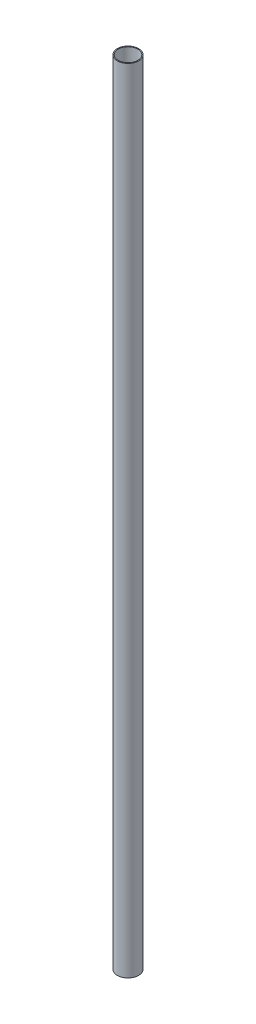
ISO-10303-21;
HEADER;
FILE_DESCRIPTION(('STEP AP214'),'2;1');
FILE_NAME('part.step','',(''),(''),'','','');
FILE_SCHEMA(('AUTOMOTIVE_DESIGN { 1 0 10303 214 1 1 1 1 }'));
ENDSEC;
DATA;
#1=APPLICATION_CONTEXT('core data for automotive mechanical design processes');
#2=APPLICATION_PROTOCOL_DEFINITION('international standard','automotive_design',2000,#1);
#3=PRODUCT_CONTEXT('',#1,'mechanical');
#4=PRODUCT('Part','Part','',(#3));
#5=PRODUCT_RELATED_PRODUCT_CATEGORY('part','',(#4));
#6=PRODUCT_DEFINITION_FORMATION('','',#4);
#7=PRODUCT_DEFINITION_CONTEXT('part definition',#1,'design');
#8=PRODUCT_DEFINITION('design','',#6,#7);
#9=PRODUCT_DEFINITION_SHAPE('','',#8);
#10=(LENGTH_UNIT() NAMED_UNIT(*) SI_UNIT(.MILLI.,.METRE.));
#11=(NAMED_UNIT(*) PLANE_ANGLE_UNIT() SI_UNIT($,.RADIAN.));
#12=(NAMED_UNIT(*) SI_UNIT($,.STERADIAN.) SOLID_ANGLE_UNIT());
#13=UNCERTAINTY_MEASURE_WITH_UNIT(LENGTH_MEASURE(1.E-05),#10,'distance_accuracy_value','');
#14=(GEOMETRIC_REPRESENTATION_CONTEXT(3) GLOBAL_UNCERTAINTY_ASSIGNED_CONTEXT((#13)) GLOBAL_UNIT_ASSIGNED_CONTEXT((#10,
#11,#12)) REPRESENTATION_CONTEXT('',''));
#15=CARTESIAN_POINT('',(0.,0.,0.));
#16=DIRECTION('',(0.,0.,1.));
#17=DIRECTION('',(1.,0.,0.));
#18=AXIS2_PLACEMENT_3D('',#15,#16,#17);
#19=CARTESIAN_POINT('',(0.,445.,0.));
#20=DIRECTION('',(0.,1.,0.));
#21=DIRECTION('',(0.,0.,1.));
#22=AXIS2_PLACEMENT_3D('',#19,#20,#21);
#23=PLANE('',#22);
#24=CARTESIAN_POINT('',(0.,445.,0.));
#25=DIRECTION('',(0.,1.,0.));
#26=DIRECTION('',(0.,0.,1.));
#27=AXIS2_PLACEMENT_3D('',#24,#25,#26);
#28=CIRCLE('',#27,6.);
#29=CARTESIAN_POINT('',(0.,445.,6.));
#30=VERTEX_POINT('',#29);
#31=EDGE_CURVE('E10',#30,#30,#28,.T.);
#32=ORIENTED_EDGE('',*,*,#31,.T.);
#33=EDGE_LOOP('',(#32));
#34=FACE_BOUND('',#33,.T.);
#35=CARTESIAN_POINT('',(0.,445.,0.));
#36=DIRECTION('',(0.,1.,0.));
#37=DIRECTION('',(0.,0.,1.));
#38=AXIS2_PLACEMENT_3D('',#35,#36,#37);
#39=CIRCLE('',#38,5.5);
#40=CARTESIAN_POINT('',(0.,445.,5.5));
#41=VERTEX_POINT('',#40);
#42=EDGE_CURVE('E44',#41,#41,#39,.T.);
#43=ORIENTED_EDGE('',*,*,#42,.F.);
#44=EDGE_LOOP('',(#43));
#45=FACE_BOUND('',#44,.T.);
#46=ADVANCED_FACE('F33',(#34,#45),#23,.T.);
#47=CARTESIAN_POINT('',(0.,0.,0.));
#48=DIRECTION('',(0.,1.,0.));
#49=DIRECTION('',(0.,0.,1.));
#50=AXIS2_PLACEMENT_3D('',#47,#48,#49);
#51=PLANE('',#50);
#52=CARTESIAN_POINT('',(0.,0.,0.));
#53=DIRECTION('',(0.,1.,0.));
#54=DIRECTION('',(0.,0.,1.));
#55=AXIS2_PLACEMENT_3D('',#52,#53,#54);
#56=CIRCLE('',#55,6.);
#57=CARTESIAN_POINT('',(0.,0.,6.));
#58=VERTEX_POINT('',#57);
#59=EDGE_CURVE('E37',#58,#58,#56,.T.);
#60=ORIENTED_EDGE('',*,*,#59,.F.);
#61=EDGE_LOOP('',(#60));
#62=FACE_BOUND('',#61,.T.);
#63=CARTESIAN_POINT('',(0.,0.,0.));
#64=DIRECTION('',(0.,1.,0.));
#65=DIRECTION('',(0.,0.,1.));
#66=AXIS2_PLACEMENT_3D('',#63,#64,#65);
#67=CIRCLE('',#66,5.5);
#68=CARTESIAN_POINT('',(0.,0.,5.5));
#69=VERTEX_POINT('',#68);
#70=EDGE_CURVE('E46',#69,#69,#67,.T.);
#71=ORIENTED_EDGE('',*,*,#70,.T.);
#72=EDGE_LOOP('',(#71));
#73=FACE_BOUND('',#72,.T.);
#74=ADVANCED_FACE('F56',(#62,#73),#51,.F.);
#75=CARTESIAN_POINT('',(0.,445.,0.));
#76=DIRECTION('',(0.,-1.,0.));
#77=DIRECTION('',(0.,0.,-1.));
#78=AXIS2_PLACEMENT_3D('',#75,#76,#77);
#79=CYLINDRICAL_SURFACE('',#78,6.);
#80=ORIENTED_EDGE('',*,*,#31,.F.);
#81=EDGE_LOOP('',(#80));
#82=FACE_BOUND('',#81,.T.);
#83=ORIENTED_EDGE('',*,*,#59,.T.);
#84=EDGE_LOOP('',(#83));
#85=FACE_BOUND('',#84,.T.);
#86=ADVANCED_FACE('F35',(#82,#85),#79,.T.);
#87=CARTESIAN_POINT('',(0.,445.,0.));
#88=DIRECTION('',(0.,-1.,0.));
#89=DIRECTION('',(0.,0.,-1.));
#90=AXIS2_PLACEMENT_3D('',#87,#88,#89);
#91=CYLINDRICAL_SURFACE('',#90,5.5);
#92=ORIENTED_EDGE('',*,*,#42,.T.);
#93=EDGE_LOOP('',(#92));
#94=FACE_BOUND('',#93,.T.);
#95=ORIENTED_EDGE('',*,*,#70,.F.);
#96=EDGE_LOOP('',(#95));
#97=FACE_BOUND('',#96,.T.);
#98=ADVANCED_FACE('F52',(#94,#97),#91,.F.);
#99=CLOSED_SHELL('',(#46,#74,#86,#98));
#100=MANIFOLD_SOLID_BREP('B2',#99);
#101=ADVANCED_BREP_SHAPE_REPRESENTATION('',(#18,#100),#14);
#102=SHAPE_DEFINITION_REPRESENTATION(#9,#101);
ENDSEC;
END-ISO-10303-21;
